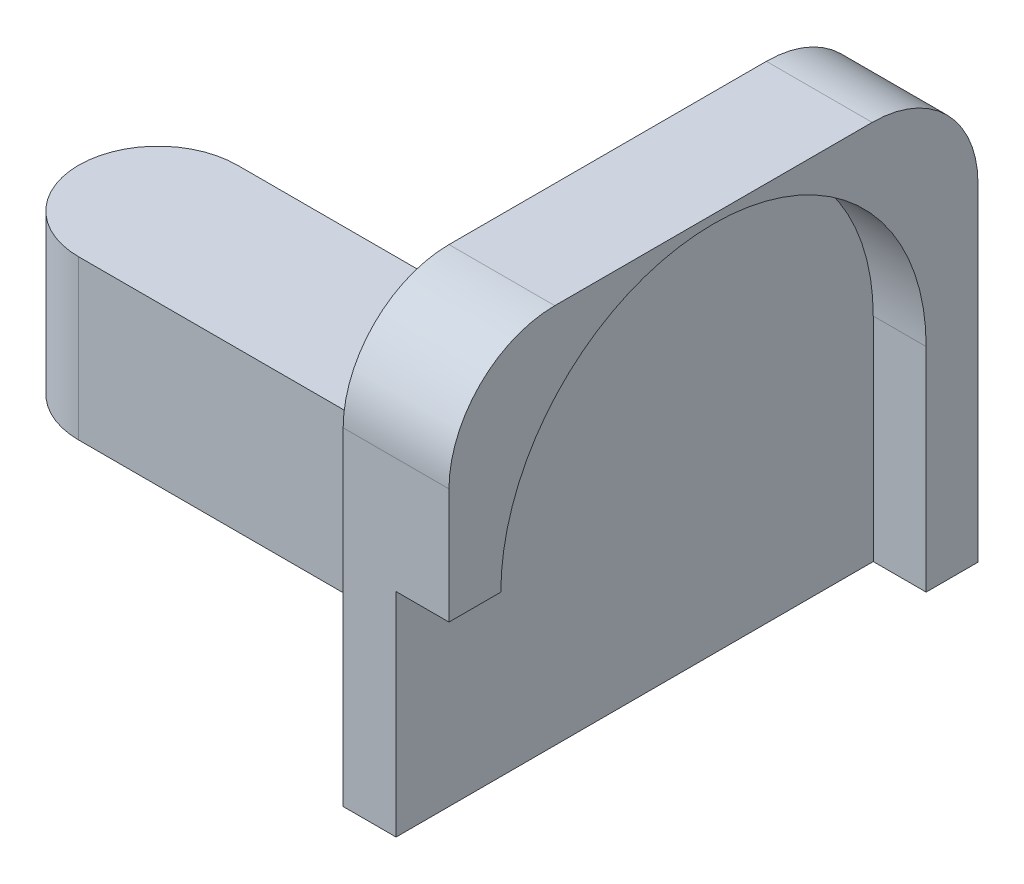
ISO-10303-21;
HEADER;
FILE_DESCRIPTION(('STEP AP214'),'2;1');
FILE_NAME('part.step','',(''),(''),'','','');
FILE_SCHEMA(('AUTOMOTIVE_DESIGN { 1 0 10303 214 1 1 1 1 }'));
ENDSEC;
DATA;
#1=APPLICATION_CONTEXT('core data for automotive mechanical design processes');
#2=APPLICATION_PROTOCOL_DEFINITION('international standard','automotive_design',2000,#1);
#3=PRODUCT_CONTEXT('',#1,'mechanical');
#4=PRODUCT('Part','Part','',(#3));
#5=PRODUCT_RELATED_PRODUCT_CATEGORY('part','',(#4));
#6=PRODUCT_DEFINITION_FORMATION('','',#4);
#7=PRODUCT_DEFINITION_CONTEXT('part definition',#1,'design');
#8=PRODUCT_DEFINITION('design','',#6,#7);
#9=PRODUCT_DEFINITION_SHAPE('','',#8);
#10=(LENGTH_UNIT() NAMED_UNIT(*) SI_UNIT(.MILLI.,.METRE.));
#11=(NAMED_UNIT(*) PLANE_ANGLE_UNIT() SI_UNIT($,.RADIAN.));
#12=(NAMED_UNIT(*) SI_UNIT($,.STERADIAN.) SOLID_ANGLE_UNIT());
#13=UNCERTAINTY_MEASURE_WITH_UNIT(LENGTH_MEASURE(1.E-05),#10,'distance_accuracy_value','');
#14=(GEOMETRIC_REPRESENTATION_CONTEXT(3) GLOBAL_UNCERTAINTY_ASSIGNED_CONTEXT((#13)) GLOBAL_UNIT_ASSIGNED_CONTEXT((#10,
#11,#12)) REPRESENTATION_CONTEXT('',''));
#15=CARTESIAN_POINT('',(0.,0.,0.));
#16=DIRECTION('',(0.,0.,1.));
#17=DIRECTION('',(1.,0.,0.));
#18=AXIS2_PLACEMENT_3D('',#15,#16,#17);
#19=CARTESIAN_POINT('',(5.,0.,0.));
#20=DIRECTION('',(-1.,0.,0.));
#21=DIRECTION('',(0.,0.,1.));
#22=AXIS2_PLACEMENT_3D('',#19,#20,#21);
#23=PLANE('',#22);
#24=DIRECTION('',(0.,0.,-1.));
#25=VECTOR('',#24,1.);
#26=CARTESIAN_POINT('',(5.,-0.400000000000005,0.));
#27=LINE('',#26,#25);
#28=CARTESIAN_POINT('',(5.,-0.400000000000005,25.));
#29=VERTEX_POINT('',#28);
#30=CARTESIAN_POINT('',(5.,-0.400000000000005,20.1));
#31=VERTEX_POINT('',#30);
#32=EDGE_CURVE('E185',#29,#31,#27,.T.);
#33=ORIENTED_EDGE('',*,*,#32,.F.);
#34=DIRECTION('',(0.,-1.,0.));
#35=VECTOR('',#34,1.);
#36=CARTESIAN_POINT('',(5.,-20.5,25.));
#37=LINE('',#36,#35);
#38=CARTESIAN_POINT('',(5.,-20.5,25.));
#39=VERTEX_POINT('',#38);
#40=EDGE_CURVE('E225',#29,#39,#37,.T.);
#41=ORIENTED_EDGE('',*,*,#40,.T.);
#42=DIRECTION('',(0.,0.,-1.));
#43=VECTOR('',#42,1.);
#44=CARTESIAN_POINT('',(5.,-20.5,25.));
#45=LINE('',#44,#43);
#46=CARTESIAN_POINT('',(5.,-20.5,-20.1));
#47=VERTEX_POINT('',#46);
#48=EDGE_CURVE('E227',#39,#47,#45,.T.);
#49=ORIENTED_EDGE('',*,*,#48,.T.);
#50=DIRECTION('',(0.,1.,0.));
#51=VECTOR('',#50,1.);
#52=CARTESIAN_POINT('',(5.,0.,-20.1));
#53=LINE('',#52,#51);
#54=CARTESIAN_POINT('',(5.,-0.400000000000005,-20.1));
#55=VERTEX_POINT('',#54);
#56=EDGE_CURVE('E202',#47,#55,#53,.T.);
#57=ORIENTED_EDGE('',*,*,#56,.T.);
#58=CARTESIAN_POINT('',(5.,-0.400000000000005,0.));
#59=DIRECTION('',(1.,0.,0.));
#60=DIRECTION('',(0.,0.,-1.));
#61=AXIS2_PLACEMENT_3D('',#58,#59,#60);
#62=CIRCLE('',#61,20.1);
#63=EDGE_CURVE('E169',#55,#31,#62,.T.);
#64=ORIENTED_EDGE('',*,*,#63,.T.);
#65=EDGE_LOOP('',(#33,#41,#49,#57,#64));
#66=FACE_BOUND('',#65,.T.);
#67=ADVANCED_FACE('F43',(#66),#23,.F.);
#68=CARTESIAN_POINT('',(5.,-20.5,-25.));
#69=DIRECTION('',(0.,0.,1.));
#70=DIRECTION('',(1.,0.,0.));
#71=AXIS2_PLACEMENT_3D('',#68,#69,#70);
#72=PLANE('',#71);
#73=DIRECTION('',(0.,1.,0.));
#74=VECTOR('',#73,1.);
#75=CARTESIAN_POINT('',(0.,-20.5,-25.));
#76=LINE('',#75,#74);
#77=CARTESIAN_POINT('',(0.,-20.5,-25.));
#78=VERTEX_POINT('',#77);
#79=CARTESIAN_POINT('',(0.,10.5,-25.));
#80=VERTEX_POINT('',#79);
#81=EDGE_CURVE('E224',#78,#80,#76,.T.);
#82=ORIENTED_EDGE('',*,*,#81,.T.);
#83=DIRECTION('',(-1.,0.,0.));
#84=VECTOR('',#83,1.);
#85=CARTESIAN_POINT('',(5.,10.5,-25.));
#86=LINE('',#85,#84);
#87=CARTESIAN_POINT('',(10.,10.5,-25.));
#88=VERTEX_POINT('',#87);
#89=EDGE_CURVE('E11',#80,#88,#86,.F.);
#90=ORIENTED_EDGE('',*,*,#89,.T.);
#91=DIRECTION('',(0.,1.,0.));
#92=VECTOR('',#91,1.);
#93=CARTESIAN_POINT('',(10.,0.,-25.));
#94=LINE('',#93,#92);
#95=CARTESIAN_POINT('',(10.,-20.5,-25.));
#96=VERTEX_POINT('',#95);
#97=EDGE_CURVE('E191',#96,#88,#94,.T.);
#98=ORIENTED_EDGE('',*,*,#97,.F.);
#99=DIRECTION('',(-1.,0.,0.));
#100=VECTOR('',#99,1.);
#101=CARTESIAN_POINT('',(5.,-20.5,-25.));
#102=LINE('',#101,#100);
#103=EDGE_CURVE('E231',#96,#78,#102,.T.);
#104=ORIENTED_EDGE('',*,*,#103,.T.);
#105=EDGE_LOOP('',(#82,#90,#98,#104));
#106=FACE_BOUND('',#105,.T.);
#107=ADVANCED_FACE('F312',(#106),#72,.F.);
#108=CARTESIAN_POINT('',(5.,20.5,25.));
#109=DIRECTION('',(0.,-1.,0.));
#110=DIRECTION('',(0.,0.,-1.));
#111=AXIS2_PLACEMENT_3D('',#108,#109,#110);
#112=PLANE('',#111);
#113=DIRECTION('',(0.,0.,1.));
#114=VECTOR('',#113,1.);
#115=CARTESIAN_POINT('',(0.,20.5,25.));
#116=LINE('',#115,#114);
#117=CARTESIAN_POINT('',(0.,20.5,-15.));
#118=VERTEX_POINT('',#117);
#119=CARTESIAN_POINT('',(0.,20.5,15.));
#120=VERTEX_POINT('',#119);
#121=EDGE_CURVE('E233',#118,#120,#116,.T.);
#122=ORIENTED_EDGE('',*,*,#121,.T.);
#123=DIRECTION('',(-1.,0.,0.));
#124=VECTOR('',#123,1.);
#125=CARTESIAN_POINT('',(5.,20.5,15.));
#126=LINE('',#125,#124);
#127=CARTESIAN_POINT('',(10.,20.5,15.));
#128=VERTEX_POINT('',#127);
#129=EDGE_CURVE('E64',#120,#128,#126,.F.);
#130=ORIENTED_EDGE('',*,*,#129,.T.);
#131=DIRECTION('',(0.,0.,1.));
#132=VECTOR('',#131,1.);
#133=CARTESIAN_POINT('',(10.,20.5,0.));
#134=LINE('',#133,#132);
#135=CARTESIAN_POINT('',(10.,20.5,-15.));
#136=VERTEX_POINT('',#135);
#137=EDGE_CURVE('E195',#136,#128,#134,.T.);
#138=ORIENTED_EDGE('',*,*,#137,.F.);
#139=DIRECTION('',(-1.,0.,0.));
#140=VECTOR('',#139,1.);
#141=CARTESIAN_POINT('',(5.,20.5,-15.));
#142=LINE('',#141,#140);
#143=EDGE_CURVE('E287',#136,#118,#142,.T.);
#144=ORIENTED_EDGE('',*,*,#143,.T.);
#145=EDGE_LOOP('',(#122,#130,#138,#144));
#146=FACE_BOUND('',#145,.T.);
#147=ADVANCED_FACE('F306',(#146),#112,.F.);
#148=CARTESIAN_POINT('',(5.,-20.5,25.));
#149=DIRECTION('',(0.,0.,-1.));
#150=DIRECTION('',(-1.,0.,0.));
#151=AXIS2_PLACEMENT_3D('',#148,#149,#150);
#152=PLANE('',#151);
#153=DIRECTION('',(0.,-1.,0.));
#154=VECTOR('',#153,1.);
#155=CARTESIAN_POINT('',(10.,0.,25.));
#156=LINE('',#155,#154);
#157=CARTESIAN_POINT('',(10.,10.5,25.));
#158=VERTEX_POINT('',#157);
#159=CARTESIAN_POINT('',(10.,-0.400000000000005,25.));
#160=VERTEX_POINT('',#159);
#161=EDGE_CURVE('E197',#158,#160,#156,.T.);
#162=ORIENTED_EDGE('',*,*,#161,.F.);
#163=DIRECTION('',(-1.,0.,0.));
#164=VECTOR('',#163,1.);
#165=CARTESIAN_POINT('',(5.,10.5,25.));
#166=LINE('',#165,#164);
#167=CARTESIAN_POINT('',(0.,10.5,25.));
#168=VERTEX_POINT('',#167);
#169=EDGE_CURVE('E278',#158,#168,#166,.T.);
#170=ORIENTED_EDGE('',*,*,#169,.T.);
#171=DIRECTION('',(0.,-1.,0.));
#172=VECTOR('',#171,1.);
#173=CARTESIAN_POINT('',(0.,-20.5,25.));
#174=LINE('',#173,#172);
#175=CARTESIAN_POINT('',(0.,-20.5,25.));
#176=VERTEX_POINT('',#175);
#177=EDGE_CURVE('E235',#168,#176,#174,.T.);
#178=ORIENTED_EDGE('',*,*,#177,.T.);
#179=DIRECTION('',(-1.,0.,0.));
#180=VECTOR('',#179,1.);
#181=CARTESIAN_POINT('',(5.,-20.5,25.));
#182=LINE('',#181,#180);
#183=EDGE_CURVE('E242',#39,#176,#182,.T.);
#184=ORIENTED_EDGE('',*,*,#183,.F.);
#185=ORIENTED_EDGE('',*,*,#40,.F.);
#186=DIRECTION('',(-1.,0.,0.));
#187=VECTOR('',#186,1.);
#188=CARTESIAN_POINT('',(10.,-0.400000000000005,25.));
#189=LINE('',#188,#187);
#190=EDGE_CURVE('E208',#160,#29,#189,.T.);
#191=ORIENTED_EDGE('',*,*,#190,.F.);
#192=EDGE_LOOP('',(#162,#170,#178,#184,#185,#191));
#193=FACE_BOUND('',#192,.T.);
#194=ADVANCED_FACE('F298',(#193),#152,.F.);
#195=CARTESIAN_POINT('',(5.,-20.5,25.));
#196=DIRECTION('',(0.,1.,0.));
#197=DIRECTION('',(0.,0.,1.));
#198=AXIS2_PLACEMENT_3D('',#195,#196,#197);
#199=PLANE('',#198);
#200=CARTESIAN_POINT('',(-42.5,-20.5,0.));
#201=DIRECTION('',(0.,1.,0.));
#202=DIRECTION('',(0.,0.,1.));
#203=AXIS2_PLACEMENT_3D('',#200,#201,#202);
#204=CIRCLE('',#203,7.5);
#205=CARTESIAN_POINT('',(-42.5,-20.5,7.5));
#206=VERTEX_POINT('',#205);
#207=CARTESIAN_POINT('',(-50.,-20.5,0.));
#208=VERTEX_POINT('',#207);
#209=EDGE_CURVE('E245',#206,#208,#204,.F.);
#210=ORIENTED_EDGE('',*,*,#209,.T.);
#211=CARTESIAN_POINT('',(-42.5,-20.5,0.));
#212=DIRECTION('',(0.,1.,0.));
#213=DIRECTION('',(0.,0.,1.));
#214=AXIS2_PLACEMENT_3D('',#211,#212,#213);
#215=CIRCLE('',#214,7.5);
#216=CARTESIAN_POINT('',(-42.5,-20.5,-7.5));
#217=VERTEX_POINT('',#216);
#218=EDGE_CURVE('E247',#208,#217,#215,.F.);
#219=ORIENTED_EDGE('',*,*,#218,.T.);
#220=DIRECTION('',(1.,0.,0.));
#221=VECTOR('',#220,1.);
#222=CARTESIAN_POINT('',(-50.,-20.5,-7.5));
#223=LINE('',#222,#221);
#224=CARTESIAN_POINT('',(-7.5,-20.5,-7.5));
#225=VERTEX_POINT('',#224);
#226=EDGE_CURVE('E221',#217,#225,#223,.T.);
#227=ORIENTED_EDGE('',*,*,#226,.T.);
#228=CARTESIAN_POINT('',(-7.5,-20.5,-15.));
#229=DIRECTION('',(0.,1.,0.));
#230=DIRECTION('',(0.,0.,1.));
#231=AXIS2_PLACEMENT_3D('',#228,#229,#230);
#232=CIRCLE('',#231,7.5);
#233=CARTESIAN_POINT('',(0.,-20.5,-15.));
#234=VERTEX_POINT('',#233);
#235=EDGE_CURVE('E274',#225,#234,#232,.T.);
#236=ORIENTED_EDGE('',*,*,#235,.T.);
#237=DIRECTION('',(0.,0.,-1.));
#238=VECTOR('',#237,1.);
#239=CARTESIAN_POINT('',(0.,-20.5,25.));
#240=LINE('',#239,#238);
#241=EDGE_CURVE('E237',#234,#78,#240,.T.);
#242=ORIENTED_EDGE('',*,*,#241,.T.);
#243=ORIENTED_EDGE('',*,*,#103,.F.);
#244=DIRECTION('',(0.,0.,-1.));
#245=VECTOR('',#244,1.);
#246=CARTESIAN_POINT('',(10.,-20.5,0.));
#247=LINE('',#246,#245);
#248=CARTESIAN_POINT('',(10.,-20.5,-20.1));
#249=VERTEX_POINT('',#248);
#250=EDGE_CURVE('E189',#249,#96,#247,.T.);
#251=ORIENTED_EDGE('',*,*,#250,.F.);
#252=DIRECTION('',(-1.,0.,0.));
#253=VECTOR('',#252,1.);
#254=CARTESIAN_POINT('',(10.,-20.5,-20.1));
#255=LINE('',#254,#253);
#256=EDGE_CURVE('E175',#249,#47,#255,.T.);
#257=ORIENTED_EDGE('',*,*,#256,.T.);
#258=ORIENTED_EDGE('',*,*,#48,.F.);
#259=ORIENTED_EDGE('',*,*,#183,.T.);
#260=CARTESIAN_POINT('',(0.,-20.5,15.));
#261=VERTEX_POINT('',#260);
#262=EDGE_CURVE('E228',#176,#261,#240,.T.);
#263=ORIENTED_EDGE('',*,*,#262,.T.);
#264=CARTESIAN_POINT('',(-7.5,-20.5,15.));
#265=DIRECTION('',(0.,1.,0.));
#266=DIRECTION('',(0.,0.,1.));
#267=AXIS2_PLACEMENT_3D('',#264,#265,#266);
#268=CIRCLE('',#267,7.5);
#269=CARTESIAN_POINT('',(-7.5,-20.5,7.5));
#270=VERTEX_POINT('',#269);
#271=EDGE_CURVE('E272',#261,#270,#268,.T.);
#272=ORIENTED_EDGE('',*,*,#271,.T.);
#273=DIRECTION('',(1.,0.,0.));
#274=VECTOR('',#273,1.);
#275=CARTESIAN_POINT('',(-50.,-20.5,7.5));
#276=LINE('',#275,#274);
#277=EDGE_CURVE('E218',#206,#270,#276,.T.);
#278=ORIENTED_EDGE('',*,*,#277,.F.);
#279=EDGE_LOOP('',(#210,#219,#227,#236,#242,#243,#251,#257,#258,#259,#263,#272,#278));
#280=FACE_BOUND('',#279,.T.);
#281=ADVANCED_FACE('F314',(#280),#199,.F.);
#282=CARTESIAN_POINT('',(0.,0.,0.));
#283=DIRECTION('',(-1.,0.,0.));
#284=DIRECTION('',(0.,0.,1.));
#285=AXIS2_PLACEMENT_3D('',#282,#283,#284);
#286=PLANE('',#285);
#287=ORIENTED_EDGE('',*,*,#177,.F.);
#288=CARTESIAN_POINT('',(0.,10.5,15.));
#289=DIRECTION('',(-1.,0.,0.));
#290=DIRECTION('',(0.,0.,1.));
#291=AXIS2_PLACEMENT_3D('',#288,#289,#290);
#292=CIRCLE('',#291,10.);
#293=EDGE_CURVE('E285',#168,#120,#292,.T.);
#294=ORIENTED_EDGE('',*,*,#293,.T.);
#295=ORIENTED_EDGE('',*,*,#121,.F.);
#296=CARTESIAN_POINT('',(0.,10.5,-15.));
#297=DIRECTION('',(-1.,0.,0.));
#298=DIRECTION('',(0.,0.,1.));
#299=AXIS2_PLACEMENT_3D('',#296,#297,#298);
#300=CIRCLE('',#299,10.);
#301=EDGE_CURVE('E283',#118,#80,#300,.T.);
#302=ORIENTED_EDGE('',*,*,#301,.T.);
#303=ORIENTED_EDGE('',*,*,#81,.F.);
#304=ORIENTED_EDGE('',*,*,#241,.F.);
#305=DIRECTION('',(0.,-1.,0.));
#306=VECTOR('',#305,1.);
#307=CARTESIAN_POINT('',(0.,0.,-15.));
#308=LINE('',#307,#306);
#309=CARTESIAN_POINT('',(0.,-5.5,-15.));
#310=VERTEX_POINT('',#309);
#311=EDGE_CURVE('E264',#234,#310,#308,.F.);
#312=ORIENTED_EDGE('',*,*,#311,.T.);
#313=DIRECTION('',(0.,0.,-1.));
#314=VECTOR('',#313,1.);
#315=CARTESIAN_POINT('',(0.,-5.5,-7.5));
#316=LINE('',#315,#314);
#317=CARTESIAN_POINT('',(0.,-5.5,15.));
#318=VERTEX_POINT('',#317);
#319=EDGE_CURVE('E174',#318,#310,#316,.T.);
#320=ORIENTED_EDGE('',*,*,#319,.F.);
#321=DIRECTION('',(0.,1.,0.));
#322=VECTOR('',#321,1.);
#323=CARTESIAN_POINT('',(0.,0.,15.));
#324=LINE('',#323,#322);
#325=EDGE_CURVE('E267',#318,#261,#324,.F.);
#326=ORIENTED_EDGE('',*,*,#325,.T.);
#327=ORIENTED_EDGE('',*,*,#262,.F.);
#328=EDGE_LOOP('',(#287,#294,#295,#302,#303,#304,#312,#320,#326,#327));
#329=FACE_BOUND('',#328,.T.);
#330=ADVANCED_FACE('F304',(#329),#286,.T.);
#331=CARTESIAN_POINT('',(-50.,-20.5,-7.5));
#332=DIRECTION('',(0.,0.,1.));
#333=DIRECTION('',(1.,0.,0.));
#334=AXIS2_PLACEMENT_3D('',#331,#332,#333);
#335=PLANE('',#334);
#336=ORIENTED_EDGE('',*,*,#226,.F.);
#337=DIRECTION('',(0.,-1.,0.));
#338=VECTOR('',#337,1.);
#339=CARTESIAN_POINT('',(-42.5,-20.5,-7.5));
#340=LINE('',#339,#338);
#341=CARTESIAN_POINT('',(-42.5,-5.5,-7.5));
#342=VERTEX_POINT('',#341);
#343=EDGE_CURVE('E252',#217,#342,#340,.F.);
#344=ORIENTED_EDGE('',*,*,#343,.T.);
#345=DIRECTION('',(1.,0.,0.));
#346=VECTOR('',#345,1.);
#347=CARTESIAN_POINT('',(-50.,-5.5,-7.5));
#348=LINE('',#347,#346);
#349=CARTESIAN_POINT('',(-7.5,-5.5,-7.5));
#350=VERTEX_POINT('',#349);
#351=EDGE_CURVE('E212',#342,#350,#348,.T.);
#352=ORIENTED_EDGE('',*,*,#351,.T.);
#353=DIRECTION('',(0.,-1.,0.));
#354=VECTOR('',#353,1.);
#355=CARTESIAN_POINT('',(-7.5,-20.5,-7.5));
#356=LINE('',#355,#354);
#357=EDGE_CURVE('E249',#350,#225,#356,.T.);
#358=ORIENTED_EDGE('',*,*,#357,.T.);
#359=EDGE_LOOP('',(#336,#344,#352,#358));
#360=FACE_BOUND('',#359,.T.);
#361=ADVANCED_FACE('F325',(#360),#335,.F.);
#362=CARTESIAN_POINT('',(-50.,-20.5,7.5));
#363=DIRECTION('',(0.,0.,-1.));
#364=DIRECTION('',(-1.,0.,0.));
#365=AXIS2_PLACEMENT_3D('',#362,#363,#364);
#366=PLANE('',#365);
#367=DIRECTION('',(1.,0.,0.));
#368=VECTOR('',#367,1.);
#369=CARTESIAN_POINT('',(-50.,-5.5,7.5));
#370=LINE('',#369,#368);
#371=CARTESIAN_POINT('',(-42.5,-5.5,7.5));
#372=VERTEX_POINT('',#371);
#373=CARTESIAN_POINT('',(-7.5,-5.5,7.5));
#374=VERTEX_POINT('',#373);
#375=EDGE_CURVE('E215',#372,#374,#370,.T.);
#376=ORIENTED_EDGE('',*,*,#375,.F.);
#377=DIRECTION('',(0.,1.,0.));
#378=VECTOR('',#377,1.);
#379=CARTESIAN_POINT('',(-42.5,-20.5,7.5));
#380=LINE('',#379,#378);
#381=EDGE_CURVE('E262',#372,#206,#380,.F.);
#382=ORIENTED_EDGE('',*,*,#381,.T.);
#383=ORIENTED_EDGE('',*,*,#277,.T.);
#384=DIRECTION('',(0.,1.,0.));
#385=VECTOR('',#384,1.);
#386=CARTESIAN_POINT('',(-7.5,-20.5,7.5));
#387=LINE('',#386,#385);
#388=EDGE_CURVE('E259',#270,#374,#387,.T.);
#389=ORIENTED_EDGE('',*,*,#388,.T.);
#390=EDGE_LOOP('',(#376,#382,#383,#389));
#391=FACE_BOUND('',#390,.T.);
#392=ADVANCED_FACE('F339',(#391),#366,.F.);
#393=CARTESIAN_POINT('',(-50.,-5.5,-7.5));
#394=DIRECTION('',(0.,-1.,0.));
#395=DIRECTION('',(0.,0.,-1.));
#396=AXIS2_PLACEMENT_3D('',#393,#394,#395);
#397=PLANE('',#396);
#398=ORIENTED_EDGE('',*,*,#351,.F.);
#399=CARTESIAN_POINT('',(-42.5,-5.5,0.));
#400=DIRECTION('',(0.,-1.,0.));
#401=DIRECTION('',(0.,0.,-1.));
#402=AXIS2_PLACEMENT_3D('',#399,#400,#401);
#403=CIRCLE('',#402,7.5);
#404=CARTESIAN_POINT('',(-50.,-5.5,0.));
#405=VERTEX_POINT('',#404);
#406=EDGE_CURVE('E257',#342,#405,#403,.F.);
#407=ORIENTED_EDGE('',*,*,#406,.T.);
#408=CARTESIAN_POINT('',(-42.5,-5.5,0.));
#409=DIRECTION('',(0.,-1.,0.));
#410=DIRECTION('',(0.,0.,-1.));
#411=AXIS2_PLACEMENT_3D('',#408,#409,#410);
#412=CIRCLE('',#411,7.5);
#413=EDGE_CURVE('E255',#405,#372,#412,.F.);
#414=ORIENTED_EDGE('',*,*,#413,.T.);
#415=ORIENTED_EDGE('',*,*,#375,.T.);
#416=CARTESIAN_POINT('',(-7.5,-5.5,15.));
#417=DIRECTION('',(0.,-1.,0.));
#418=DIRECTION('',(0.,0.,-1.));
#419=AXIS2_PLACEMENT_3D('',#416,#417,#418);
#420=CIRCLE('',#419,7.5);
#421=EDGE_CURVE('E269',#374,#318,#420,.T.);
#422=ORIENTED_EDGE('',*,*,#421,.T.);
#423=ORIENTED_EDGE('',*,*,#319,.T.);
#424=CARTESIAN_POINT('',(-7.5,-5.5,-15.));
#425=DIRECTION('',(0.,-1.,0.));
#426=DIRECTION('',(0.,0.,-1.));
#427=AXIS2_PLACEMENT_3D('',#424,#425,#426);
#428=CIRCLE('',#427,7.5);
#429=EDGE_CURVE('E276',#310,#350,#428,.T.);
#430=ORIENTED_EDGE('',*,*,#429,.T.);
#431=EDGE_LOOP('',(#398,#407,#414,#415,#422,#423,#430));
#432=FACE_BOUND('',#431,.T.);
#433=ADVANCED_FACE('F322',(#432),#397,.F.);
#434=CARTESIAN_POINT('',(10.,-0.400000000000005,0.));
#435=DIRECTION('',(-1.,0.,0.));
#436=DIRECTION('',(0.,0.,1.));
#437=AXIS2_PLACEMENT_3D('',#434,#435,#436);
#438=CYLINDRICAL_SURFACE('',#437,20.1);
#439=ORIENTED_EDGE('',*,*,#63,.F.);
#440=DIRECTION('',(-1.,0.,0.));
#441=VECTOR('',#440,1.);
#442=CARTESIAN_POINT('',(10.,-0.400000000000005,-20.1));
#443=LINE('',#442,#441);
#444=CARTESIAN_POINT('',(10.,-0.400000000000005,-20.1));
#445=VERTEX_POINT('',#444);
#446=EDGE_CURVE('E164',#445,#55,#443,.T.);
#447=ORIENTED_EDGE('',*,*,#446,.F.);
#448=CARTESIAN_POINT('',(10.,-0.400000000000005,0.));
#449=DIRECTION('',(1.,0.,0.));
#450=DIRECTION('',(0.,0.,-1.));
#451=AXIS2_PLACEMENT_3D('',#448,#449,#450);
#452=CIRCLE('',#451,20.1);
#453=CARTESIAN_POINT('',(10.,-0.400000000000005,20.1));
#454=VERTEX_POINT('',#453);
#455=EDGE_CURVE('E167',#445,#454,#452,.T.);
#456=ORIENTED_EDGE('',*,*,#455,.T.);
#457=DIRECTION('',(-1.,0.,0.));
#458=VECTOR('',#457,1.);
#459=CARTESIAN_POINT('',(10.,-0.400000000000005,20.1));
#460=LINE('',#459,#458);
#461=EDGE_CURVE('E200',#454,#31,#460,.T.);
#462=ORIENTED_EDGE('',*,*,#461,.T.);
#463=EDGE_LOOP('',(#439,#447,#456,#462));
#464=FACE_BOUND('',#463,.T.);
#465=ADVANCED_FACE('F166',(#464),#438,.F.);
#466=CARTESIAN_POINT('',(10.,0.,-20.1));
#467=DIRECTION('',(0.,0.,1.));
#468=DIRECTION('',(1.,0.,0.));
#469=AXIS2_PLACEMENT_3D('',#466,#467,#468);
#470=PLANE('',#469);
#471=ORIENTED_EDGE('',*,*,#56,.F.);
#472=ORIENTED_EDGE('',*,*,#256,.F.);
#473=DIRECTION('',(0.,1.,0.));
#474=VECTOR('',#473,1.);
#475=CARTESIAN_POINT('',(10.,0.,-20.1));
#476=LINE('',#475,#474);
#477=EDGE_CURVE('E181',#249,#445,#476,.T.);
#478=ORIENTED_EDGE('',*,*,#477,.T.);
#479=ORIENTED_EDGE('',*,*,#446,.T.);
#480=EDGE_LOOP('',(#471,#472,#478,#479));
#481=FACE_BOUND('',#480,.T.);
#482=ADVANCED_FACE('F187',(#481),#470,.T.);
#483=CARTESIAN_POINT('',(10.,-0.400000000000005,0.));
#484=DIRECTION('',(0.,1.,0.));
#485=DIRECTION('',(0.,0.,1.));
#486=AXIS2_PLACEMENT_3D('',#483,#484,#485);
#487=PLANE('',#486);
#488=ORIENTED_EDGE('',*,*,#32,.T.);
#489=ORIENTED_EDGE('',*,*,#461,.F.);
#490=DIRECTION('',(0.,0.,-1.));
#491=VECTOR('',#490,1.);
#492=CARTESIAN_POINT('',(10.,-0.400000000000005,0.));
#493=LINE('',#492,#491);
#494=EDGE_CURVE('E183',#160,#454,#493,.T.);
#495=ORIENTED_EDGE('',*,*,#494,.F.);
#496=ORIENTED_EDGE('',*,*,#190,.T.);
#497=EDGE_LOOP('',(#488,#489,#495,#496));
#498=FACE_BOUND('',#497,.T.);
#499=ADVANCED_FACE('F378',(#498),#487,.F.);
#500=CARTESIAN_POINT('',(10.,0.,0.));
#501=DIRECTION('',(1.,0.,0.));
#502=DIRECTION('',(0.,0.,-1.));
#503=AXIS2_PLACEMENT_3D('',#500,#501,#502);
#504=PLANE('',#503);
#505=ORIENTED_EDGE('',*,*,#137,.T.);
#506=CARTESIAN_POINT('',(10.,10.5,15.));
#507=DIRECTION('',(1.,0.,0.));
#508=DIRECTION('',(0.,0.,-1.));
#509=AXIS2_PLACEMENT_3D('',#506,#507,#508);
#510=CIRCLE('',#509,10.);
#511=EDGE_CURVE('E51',#128,#158,#510,.T.);
#512=ORIENTED_EDGE('',*,*,#511,.T.);
#513=ORIENTED_EDGE('',*,*,#161,.T.);
#514=ORIENTED_EDGE('',*,*,#494,.T.);
#515=ORIENTED_EDGE('',*,*,#455,.F.);
#516=ORIENTED_EDGE('',*,*,#477,.F.);
#517=ORIENTED_EDGE('',*,*,#250,.T.);
#518=ORIENTED_EDGE('',*,*,#97,.T.);
#519=CARTESIAN_POINT('',(10.,10.5,-15.));
#520=DIRECTION('',(1.,0.,0.));
#521=DIRECTION('',(0.,0.,-1.));
#522=AXIS2_PLACEMENT_3D('',#519,#520,#521);
#523=CIRCLE('',#522,10.);
#524=EDGE_CURVE('E291',#88,#136,#523,.T.);
#525=ORIENTED_EDGE('',*,*,#524,.T.);
#526=EDGE_LOOP('',(#505,#512,#513,#514,#515,#516,#517,#518,#525));
#527=FACE_BOUND('',#526,.T.);
#528=ADVANCED_FACE('F179',(#527),#504,.T.);
#529=CARTESIAN_POINT('',(-42.5,0.,0.));
#530=DIRECTION('',(0.,1.,0.));
#531=DIRECTION('',(0.,0.,1.));
#532=AXIS2_PLACEMENT_3D('',#529,#530,#531);
#533=CYLINDRICAL_SURFACE('',#532,7.5);
#534=ORIENTED_EDGE('',*,*,#381,.F.);
#535=ORIENTED_EDGE('',*,*,#413,.F.);
#536=DIRECTION('',(0.,1.,0.));
#537=VECTOR('',#536,1.);
#538=CARTESIAN_POINT('',(-50.,0.,0.));
#539=LINE('',#538,#537);
#540=EDGE_CURVE('E203',#208,#405,#539,.T.);
#541=ORIENTED_EDGE('',*,*,#540,.F.);
#542=ORIENTED_EDGE('',*,*,#209,.F.);
#543=EDGE_LOOP('',(#534,#535,#541,#542));
#544=FACE_BOUND('',#543,.T.);
#545=ADVANCED_FACE('F335',(#544),#533,.T.);
#546=CARTESIAN_POINT('',(-42.5,0.,0.));
#547=DIRECTION('',(0.,-1.,0.));
#548=DIRECTION('',(0.,0.,-1.));
#549=AXIS2_PLACEMENT_3D('',#546,#547,#548);
#550=CYLINDRICAL_SURFACE('',#549,7.5);
#551=ORIENTED_EDGE('',*,*,#406,.F.);
#552=ORIENTED_EDGE('',*,*,#343,.F.);
#553=ORIENTED_EDGE('',*,*,#218,.F.);
#554=ORIENTED_EDGE('',*,*,#540,.T.);
#555=EDGE_LOOP('',(#551,#552,#553,#554));
#556=FACE_BOUND('',#555,.T.);
#557=ADVANCED_FACE('F329',(#556),#550,.T.);
#558=CARTESIAN_POINT('',(-7.5,-20.5,15.));
#559=DIRECTION('',(0.,1.,0.));
#560=DIRECTION('',(0.,0.,1.));
#561=AXIS2_PLACEMENT_3D('',#558,#559,#560);
#562=CYLINDRICAL_SURFACE('',#561,7.5);
#563=ORIENTED_EDGE('',*,*,#271,.F.);
#564=ORIENTED_EDGE('',*,*,#325,.F.);
#565=ORIENTED_EDGE('',*,*,#421,.F.);
#566=ORIENTED_EDGE('',*,*,#388,.F.);
#567=EDGE_LOOP('',(#563,#564,#565,#566));
#568=FACE_BOUND('',#567,.T.);
#569=ADVANCED_FACE('F344',(#568),#562,.F.);
#570=CARTESIAN_POINT('',(-7.5,-20.5,-15.));
#571=DIRECTION('',(0.,-1.,0.));
#572=DIRECTION('',(0.,0.,-1.));
#573=AXIS2_PLACEMENT_3D('',#570,#571,#572);
#574=CYLINDRICAL_SURFACE('',#573,7.5);
#575=ORIENTED_EDGE('',*,*,#429,.F.);
#576=ORIENTED_EDGE('',*,*,#311,.F.);
#577=ORIENTED_EDGE('',*,*,#235,.F.);
#578=ORIENTED_EDGE('',*,*,#357,.F.);
#579=EDGE_LOOP('',(#575,#576,#577,#578));
#580=FACE_BOUND('',#579,.T.);
#581=ADVANCED_FACE('F318',(#580),#574,.F.);
#582=CARTESIAN_POINT('',(5.,10.5,15.));
#583=DIRECTION('',(-1.,0.,0.));
#584=DIRECTION('',(0.,0.,1.));
#585=AXIS2_PLACEMENT_3D('',#582,#583,#584);
#586=CYLINDRICAL_SURFACE('',#585,10.);
#587=ORIENTED_EDGE('',*,*,#511,.F.);
#588=ORIENTED_EDGE('',*,*,#129,.F.);
#589=ORIENTED_EDGE('',*,*,#293,.F.);
#590=ORIENTED_EDGE('',*,*,#169,.F.);
#591=EDGE_LOOP('',(#587,#588,#589,#590));
#592=FACE_BOUND('',#591,.T.);
#593=ADVANCED_FACE('F301',(#592),#586,.T.);
#594=CARTESIAN_POINT('',(5.,10.5,-15.));
#595=DIRECTION('',(-1.,0.,0.));
#596=DIRECTION('',(0.,0.,1.));
#597=AXIS2_PLACEMENT_3D('',#594,#595,#596);
#598=CYLINDRICAL_SURFACE('',#597,10.);
#599=ORIENTED_EDGE('',*,*,#524,.F.);
#600=ORIENTED_EDGE('',*,*,#89,.F.);
#601=ORIENTED_EDGE('',*,*,#301,.F.);
#602=ORIENTED_EDGE('',*,*,#143,.F.);
#603=EDGE_LOOP('',(#599,#600,#601,#602));
#604=FACE_BOUND('',#603,.T.);
#605=ADVANCED_FACE('F45',(#604),#598,.T.);
#606=CLOSED_SHELL('',(#67,#107,#147,#194,#281,#330,#361,#392,#433,#465,#482,#499,#528,#545,#557,
#569,#581,#593,#605));
#607=MANIFOLD_SOLID_BREP('B2',#606);
#608=ADVANCED_BREP_SHAPE_REPRESENTATION('',(#18,#607),#14);
#609=SHAPE_DEFINITION_REPRESENTATION(#9,#608);
ENDSEC;
END-ISO-10303-21;
